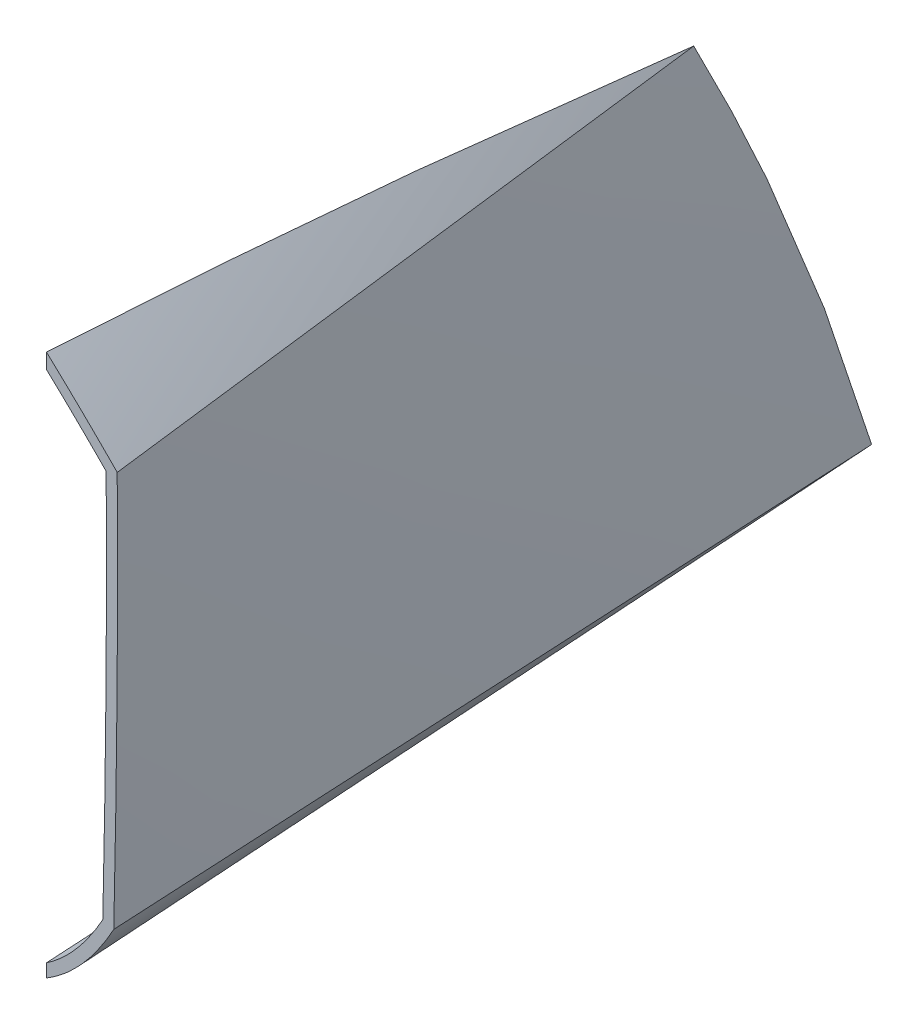
ISO-10303-21;
HEADER;
FILE_DESCRIPTION(('STEP AP214'),'2;1');
FILE_NAME('part.step','',(''),(''),'','','');
FILE_SCHEMA(('AUTOMOTIVE_DESIGN { 1 0 10303 214 1 1 1 1 }'));
ENDSEC;
DATA;
#1=APPLICATION_CONTEXT('core data for automotive mechanical design processes');
#2=APPLICATION_PROTOCOL_DEFINITION('international standard','automotive_design',2000,#1);
#3=PRODUCT_CONTEXT('',#1,'mechanical');
#4=PRODUCT('Part','Part','',(#3));
#5=PRODUCT_RELATED_PRODUCT_CATEGORY('part','',(#4));
#6=PRODUCT_DEFINITION_FORMATION('','',#4);
#7=PRODUCT_DEFINITION_CONTEXT('part definition',#1,'design');
#8=PRODUCT_DEFINITION('design','',#6,#7);
#9=PRODUCT_DEFINITION_SHAPE('','',#8);
#10=(LENGTH_UNIT() NAMED_UNIT(*) SI_UNIT(.MILLI.,.METRE.));
#11=(NAMED_UNIT(*) PLANE_ANGLE_UNIT() SI_UNIT($,.RADIAN.));
#12=(NAMED_UNIT(*) SI_UNIT($,.STERADIAN.) SOLID_ANGLE_UNIT());
#13=UNCERTAINTY_MEASURE_WITH_UNIT(LENGTH_MEASURE(1.E-05),#10,'distance_accuracy_value','');
#14=(GEOMETRIC_REPRESENTATION_CONTEXT(3) GLOBAL_UNCERTAINTY_ASSIGNED_CONTEXT((#13)) GLOBAL_UNIT_ASSIGNED_CONTEXT((#10,
#11,#12)) REPRESENTATION_CONTEXT('',''));
#15=CARTESIAN_POINT('',(0.,0.,0.));
#16=DIRECTION('',(0.,0.,1.));
#17=DIRECTION('',(1.,0.,0.));
#18=AXIS2_PLACEMENT_3D('',#15,#16,#17);
#19=CARTESIAN_POINT('',(-1.85359071851745,82.3592452516909,-1001.69455516353));
#20=DIRECTION('',(0.,0.,1.));
#21=DIRECTION('',(1.,0.,0.));
#22=AXIS2_PLACEMENT_3D('',#19,#20,#21);
#23=PLANE('',#22);
#24=CARTESIAN_POINT('',(12.2506221284304,-33.3759247497954,-1001.69455516353));
#25=CARTESIAN_POINT('',(11.9665362022267,-33.8949541881302,-1001.69455516353));
#26=CARTESIAN_POINT('',(11.6743257973484,-34.4096057442278,-1001.69455516353));
#27=CARTESIAN_POINT('',(11.0723934489428,-35.4288402213775,-1001.69455516353));
#28=CARTESIAN_POINT('',(10.762664299058,-35.9334188817556,-1001.69455516353));
#29=CARTESIAN_POINT('',(10.1236969935747,-36.9322759097013,-1001.69455516353));
#30=CARTESIAN_POINT('',(9.79440246591979,-37.4265183565635,-1001.69455516353));
#31=CARTESIAN_POINT('',(9.11606821113712,-38.4011372629972,-1001.69455516353));
#32=CARTESIAN_POINT('',(8.76703173429068,-38.8815159855145,-1001.69455516353));
#33=CARTESIAN_POINT('',(7.8346468950949,-40.1067780129237,-1001.69455516353));
#34=CARTESIAN_POINT('',(7.23513855485781,-40.8395052010551,-1001.69455516353));
#35=CARTESIAN_POINT('',(5.979494781417,-42.2535459545636,-1001.69455516353));
#36=CARTESIAN_POINT('',(5.32343414048144,-42.9349252587705,-1001.69455516353));
#37=CARTESIAN_POINT('',(4.28492192137854,-43.9190621542523,-1001.69455516353));
#38=CARTESIAN_POINT('',(3.92429833393614,-44.2450130538733,-1001.69455516353));
#39=CARTESIAN_POINT('',(3.18718687117368,-44.8784817424216,-1001.69455516353));
#40=CARTESIAN_POINT('',(2.8106999818198,-45.1860006740981,-1001.69455516353));
#41=CARTESIAN_POINT('',(2.03780124533057,-45.7839573130188,-1001.69455516353));
#42=CARTESIAN_POINT('',(1.6412173648594,-46.0741731463194,-1001.69455516353));
#43=CARTESIAN_POINT('',(0.832282530133182,-46.6320591845571,-1001.69455516353));
#44=CARTESIAN_POINT('',(0.419925481484258,-46.8997205443728,-1001.69455516353));
#45=CARTESIAN_POINT('',(0.,-47.1550952644895,-1001.69455516353));
#46=B_SPLINE_CURVE_WITH_KNOTS('',3,(#24,#25,#26,#27,#28,#29,#30,#31,#32,#33,#34,#35,#36,#37,#38,
#39,#40,#41,#42,#43,#44,#45),.UNSPECIFIED.,.F.,.F.,(4,2,2,2,2,2,2,2,2,2,4),(0.,1.77508414579676,
3.55090386143224,5.33211472196976,7.11303317575827,9.95051823445551,12.7843065711353,
14.2420959691526,15.6997948931357,17.1733307575318,18.6474418305088),.UNSPECIFIED.);
#47=CARTESIAN_POINT('',(12.2506221284304,-33.3759247497954,-1001.69455516353));
#48=VERTEX_POINT('',#47);
#49=CARTESIAN_POINT('',(0.,-47.1550952644895,-1001.69455516353));
#50=VERTEX_POINT('',#49);
#51=EDGE_CURVE('E244',#48,#50,#46,.T.);
#52=ORIENTED_EDGE('',*,*,#51,.F.);
#53=CARTESIAN_POINT('',(12.87399221668,38.8691970642356,-1001.69455516353));
#54=CARTESIAN_POINT('',(12.9048302297181,35.1504771052954,-1001.69455516353));
#55=CARTESIAN_POINT('',(12.9239638330814,31.4316727044196,-1001.69455516353));
#56=CARTESIAN_POINT('',(12.9407553095581,23.9940510049274,-1001.69455516353));
#57=CARTESIAN_POINT('',(12.9384133989228,20.275233706818,-1001.69455516353));
#58=CARTESIAN_POINT('',(12.9141875333494,12.8376837752516,-1001.69455516353));
#59=CARTESIAN_POINT('',(12.892303664979,9.11895114149253,-1001.69455516353));
#60=CARTESIAN_POINT('',(12.830733533716,1.68161652383183,-1001.69455516353));
#61=CARTESIAN_POINT('',(12.7910471759719,-2.03698545926815,-1001.69455516353));
#62=CARTESIAN_POINT('',(12.6841179998572,-10.3592843173215,-1001.69455516353));
#63=CARTESIAN_POINT('',(12.6125640403761,-14.9629260026864,-1001.69455516353));
#64=CARTESIAN_POINT('',(12.4887315274928,-21.8680628172549,-1001.69455516353));
#65=CARTESIAN_POINT('',(12.4447039948589,-24.1697105043796,-1001.69455516353));
#66=CARTESIAN_POINT('',(12.3514684362362,-28.7728983635731,-1001.69455516353));
#67=CARTESIAN_POINT('',(12.3022604163367,-31.0744385357652,-1001.69455516353));
#68=CARTESIAN_POINT('',(12.2506221284304,-33.3759247497954,-1001.69455516353));
#69=B_SPLINE_CURVE_WITH_KNOTS('',3,(#53,#54,#55,#56,#57,#58,#59,#60,#61,#62,#63,#64,#65,#66,#67,
#68),.UNSPECIFIED.,.F.,.F.,(4,2,2,2,2,2,2,4),(0.,11.156506614381,22.312900886518,
33.4692457378398,44.6256500307126,58.4381768848931,65.3443785037134,72.250572004854),.UNSPECIFIED.);
#70=CARTESIAN_POINT('',(12.87399221668,38.8691970642356,-1001.69455516353));
#71=VERTEX_POINT('',#70);
#72=EDGE_CURVE('E111',#71,#48,#69,.T.);
#73=ORIENTED_EDGE('',*,*,#72,.F.);
#74=CARTESIAN_POINT('',(0.,51.3948653500808,-1001.69455515866));
#75=CARTESIAN_POINT('',(1.09627781872572,50.3762662711366,-1001.69455516134));
#76=CARTESIAN_POINT('',(2.18691561433646,49.3515699825402,-1001.6945551628));
#77=CARTESIAN_POINT('',(4.89929351519833,46.7739307055295,-1001.69455516463));
#78=CARTESIAN_POINT('',(6.51368792573782,45.2132490840453,-1001.69455516408));
#79=CARTESIAN_POINT('',(9.71498589622055,42.0629575351107,-1001.69455516298));
#80=CARTESIAN_POINT('',(11.3018807223924,40.4733387344674,-1001.69455516243));
#81=CARTESIAN_POINT('',(12.87399221668,38.8691970642356,-1001.69455516353));
#82=B_SPLINE_CURVE_WITH_KNOTS('',3,(#74,#75,#76,#77,#78,#79,#80,#81),.UNSPECIFIED.,.F.,.F.,(4,2,
2,4),(0.,4.48937281379529,11.2253352202712,17.9633991227946),.UNSPECIFIED.);
#83=CARTESIAN_POINT('',(0.,51.3947834505475,-1001.69455036764));
#84=VERTEX_POINT('',#83);
#85=EDGE_CURVE('E110',#84,#71,#82,.T.);
#86=ORIENTED_EDGE('',*,*,#85,.F.);
#87=DIRECTION('',(0.,1.,0.));
#88=VECTOR('',#87,1.);
#89=CARTESIAN_POINT('',(0.,-48.8593102653782,-1001.69455516353));
#90=LINE('',#89,#88);
#91=CARTESIAN_POINT('',(0.,48.6560876059991,-1001.69455516353));
#92=VERTEX_POINT('',#91);
#93=EDGE_CURVE('E98',#92,#84,#90,.T.);
#94=ORIENTED_EDGE('',*,*,#93,.F.);
#95=CARTESIAN_POINT('',(-0.470868415865318,49.0970837952991,-1001.69455516353));
#96=CARTESIAN_POINT('',(0.523084267422174,48.1676972357709,-1001.69455516353));
#97=CARTESIAN_POINT('',(1.51228342820327,47.2332215512614,-1001.69455516353));
#98=CARTESIAN_POINT('',(3.48071667885832,45.354059698855,-1001.69455516353));
#99=CARTESIAN_POINT('',(4.45995190410198,44.4093747201652,-1001.69455516353));
#100=CARTESIAN_POINT('',(6.40867222971882,42.5091152142906,-1001.69455516353));
#101=CARTESIAN_POINT('',(7.37815268595554,41.5535359231248,-1001.69455516353));
#102=CARTESIAN_POINT('',(9.30666198240205,39.6316681242882,-1001.69455516353));
#103=CARTESIAN_POINT('',(10.2656896044509,38.6653783943507,-1001.69455516353));
#104=CARTESIAN_POINT('',(11.2192546963813,37.6937222153595,-1001.69455516353));
#105=B_SPLINE_CURVE_WITH_KNOTS('',3,(#95,#96,#97,#98,#99,#100,#101,#102,#103,#104),
.UNSPECIFIED.,.F.,.F.,(4,2,2,2,4),(0.,4.0823044315295,8.16413836305461,12.2478314865543,
16.331995536854),.UNSPECIFIED.);
#106=CARTESIAN_POINT('',(10.8687051671316,38.0504311350924,-1001.69455516353));
#107=VERTEX_POINT('',#106);
#108=EDGE_CURVE('E108',#92,#107,#105,.T.);
#109=ORIENTED_EDGE('',*,*,#108,.T.);
#110=CARTESIAN_POINT('',(10.8634474761459,38.6976045800277,-1001.69455516353));
#111=CARTESIAN_POINT('',(10.8943604346607,34.9729664361827,-1001.69455516353));
#112=CARTESIAN_POINT('',(10.9135198264841,31.2482433955654,-1001.69455516353));
#113=CARTESIAN_POINT('',(10.930279197301,23.7987844915915,-1001.69455516353));
#114=CARTESIAN_POINT('',(10.9278793936923,20.074048628743,-1001.69455516353));
#115=CARTESIAN_POINT('',(10.9034686935525,12.624662556447,-1001.69455516353));
#116=CARTESIAN_POINT('',(10.8814578845638,8.9000123466913,-1001.69455516353));
#117=CARTESIAN_POINT('',(10.8195741517478,1.4508429209225,-1001.69455516353));
#118=CARTESIAN_POINT('',(10.7797011331417,-2.27367629429067,-1001.69455516353));
#119=CARTESIAN_POINT('',(10.6730096058491,-10.5548723520559,-1001.69455516353));
#120=CARTESIAN_POINT('',(10.6021606196896,-15.1114967582731,-1001.69455516353));
#121=CARTESIAN_POINT('',(10.4388519095471,-24.2243142427248,-1001.69455516353));
#122=CARTESIAN_POINT('',(10.3463924044207,-28.7805073248601,-1001.69455516353));
#123=CARTESIAN_POINT('',(10.2444627874,-33.3364731838275,-1001.69455516353));
#124=B_SPLINE_CURVE_WITH_KNOTS('',3,(#110,#111,#112,#113,#114,#115,#116,#117,#118,#119,#120,
#121,#122,#123),.UNSPECIFIED.,.F.,.F.,(4,2,2,2,2,2,4),(0.,11.1742622973387,22.3484119162384,
33.5225116546183,44.6966706846869,58.3681408754672,72.0394726169845),.UNSPECIFIED.);
#125=CARTESIAN_POINT('',(10.255439277234,-32.8444063220594,-1001.69455516353));
#126=VERTEX_POINT('',#125);
#127=EDGE_CURVE('E119',#107,#126,#124,.T.);
#128=ORIENTED_EDGE('',*,*,#127,.T.);
#129=CARTESIAN_POINT('',(10.5640571013501,-32.2849484133639,-1001.69455516353));
#130=CARTESIAN_POINT('',(10.53627801153,-32.3358841591618,-1001.69455516353));
#131=CARTESIAN_POINT('',(10.5084544423362,-32.3867957749957,-1001.69455516353));
#132=CARTESIAN_POINT('',(10.4526780716934,-32.4885482051723,-1001.69455516353));
#133=CARTESIAN_POINT('',(10.4247252701264,-32.5393890194503,-1001.69455516353));
#134=CARTESIAN_POINT('',(10.3406129572114,-32.6917708106522,-1001.69455516353));
#135=CARTESIAN_POINT('',(10.2841992664371,-32.7931716351265,-1001.69455516353));
#136=CARTESIAN_POINT('',(10.1139677454087,-33.0968225482233,-1001.69455516353));
#137=CARTESIAN_POINT('',(9.99916092990484,-33.2985183844586,-1001.69455516353));
#138=CARTESIAN_POINT('',(9.65060137721084,-33.901310200971,-1001.69455516353));
#139=CARTESIAN_POINT('',(9.41274496609063,-34.3000451785245,-1001.69455516353));
#140=CARTESIAN_POINT('',(8.92482445796422,-35.0915018338494,-1001.69455516353));
#141=CARTESIAN_POINT('',(8.67472857704021,-35.4842039509008,-1001.69455516353));
#142=CARTESIAN_POINT('',(8.16230973303025,-36.2615028157454,-1001.69455516353));
#143=CARTESIAN_POINT('',(7.89998747200091,-36.6461000270972,-1001.69455516353));
#144=CARTESIAN_POINT('',(7.0914217108962,-37.7894321495063,-1001.69455516353));
#145=CARTESIAN_POINT('',(6.52555115913199,-38.5344744002358,-1001.69455516353));
#146=CARTESIAN_POINT('',(5.33718986852027,-39.9768884704693,-1001.69455516353));
#147=CARTESIAN_POINT('',(4.71477460474561,-40.674321720504,-1001.69455516353));
#148=CARTESIAN_POINT('',(3.84531882898528,-41.5632037252433,-1001.69455516353));
#149=CARTESIAN_POINT('',(3.62533146375063,-41.7813762665252,-1001.69455516353));
#150=CARTESIAN_POINT('',(3.17853230007473,-42.2106142404137,-1001.69455516353));
#151=CARTESIAN_POINT('',(2.95172049888938,-42.4216796701624,-1001.69455516353));
#152=CARTESIAN_POINT('',(2.26176835556505,-43.0426235669867,-1001.69455516353));
#153=CARTESIAN_POINT('',(1.78823803200105,-43.4411474457556,-1001.69455516353));
#154=CARTESIAN_POINT('',(1.05251107449432,-44.0163360695484,-1001.69455516353));
#155=CARTESIAN_POINT('',(0.800411729980777,-44.2060554630288,-1001.69455516353));
#156=CARTESIAN_POINT('',(0.289144668280426,-44.5757397595456,-1001.69455516353));
#157=CARTESIAN_POINT('',(0.0299771805829676,-44.7557049787164,-1001.69455516353));
#158=CARTESIAN_POINT('',(-0.49599667454968,-45.1057428927189,-1001.69455516353));
#159=CARTESIAN_POINT('',(-0.762822250010449,-45.2757867396114,-1001.69455516353));
#160=CARTESIAN_POINT('',(-1.30321732101772,-45.6048815788426,-1001.69455516353));
#161=CARTESIAN_POINT('',(-1.57678776399788,-45.7639310147522,-1001.69455516353));
#162=CARTESIAN_POINT('',(-1.85359071851749,-45.917180366797,-1001.69455516353));
#163=B_SPLINE_CURVE_WITH_KNOTS('',3,(#129,#130,#131,#132,#133,#134,#135,#136,#137,#138,#139,
#140,#141,#142,#143,#144,#145,#146,#147,#148,#149,#150,#151,#152,#153,#154,#155,#156,#157,#158,
#159,#160,#161,#162),.UNSPECIFIED.,.F.,.F.,(4,2,2,2,2,2,2,2,2,2,2,2,2,2,2,2,4),(0.,
0.174055171569712,0.348110502120936,0.696219458952698,1.39244656421967,2.78512361036199,
4.18163199686166,5.57806029236415,8.3822556372154,11.1827614861744,12.1121190942666,
13.0414770760587,14.8964424381214,15.8427966065658,16.7891200851607,17.7380705097596,
18.6871549990108),.UNSPECIFIED.);
#164=CARTESIAN_POINT('',(0.,-44.7736876415708,-1001.69455516353));
#165=VERTEX_POINT('',#164);
#166=EDGE_CURVE('E116',#126,#165,#163,.T.);
#167=ORIENTED_EDGE('',*,*,#166,.T.);
#168=EDGE_CURVE('E112',#50,#165,#90,.T.);
#169=ORIENTED_EDGE('',*,*,#168,.F.);
#170=EDGE_LOOP('',(#52,#73,#86,#94,#109,#128,#167,#169));
#171=FACE_BOUND('',#170,.T.);
#172=ADVANCED_FACE('F35',(#171),#23,.T.);
#173=CARTESIAN_POINT('',(0.,-48.8593102653782,-966.458177168164));
#174=DIRECTION('',(-1.,0.,0.));
#175=DIRECTION('',(0.,0.,1.));
#176=AXIS2_PLACEMENT_3D('',#173,#174,#175);
#177=PLANE('',#176);
#178=CARTESIAN_POINT('',(0.,-55.5034688895581,-776.7));
#179=CARTESIAN_POINT('',(0.,-50.8819255286531,-968.719076754564));
#180=CARTESIAN_POINT('',(0.,-38.1699211146485,-1151.69455516353));
#181=B_SPLINE_CURVE_WITH_KNOTS('',2,(#178,#179,#180),.UNSPECIFIED.,.F.,.F.,(3,3),(0.,1.),.UNSPECIFIED.);
#182=CARTESIAN_POINT('',(0.,-38.1699211146485,-1151.69455516353));
#183=VERTEX_POINT('',#182);
#184=EDGE_CURVE('E291',#50,#183,#181,.T.);
#185=ORIENTED_EDGE('',*,*,#184,.F.);
#186=ORIENTED_EDGE('',*,*,#168,.T.);
#187=CARTESIAN_POINT('',(0.,7.56244096415004,-1739.17775413218));
#188=CARTESIAN_POINT('',(0.,6.04028558589129,-1717.71886853241));
#189=CARTESIAN_POINT('',(0.,4.51654516736458,-1696.26009524189));
#190=CARTESIAN_POINT('',(0.,1.46507010409117,-1653.34066971762));
#191=CARTESIAN_POINT('',(0.,-0.0626649259069232,-1631.88001751127));
#192=CARTESIAN_POINT('',(0.,-3.1227708473084,-1588.9573161061));
#193=CARTESIAN_POINT('',(0.,-4.65514210018143,-1567.49526693304));
#194=CARTESIAN_POINT('',(0.,-7.72537707257804,-1524.57026902678));
#195=CARTESIAN_POINT('',(0.,-9.26324111565525,-1503.10732031671));
#196=CARTESIAN_POINT('',(0.,-12.3455387340583,-1460.18103635261));
#197=CARTESIAN_POINT('',(0.,-13.8899725682438,-1438.71770111716));
#198=CARTESIAN_POINT('',(0.,-15.954523704723,-1410.10016185366));
#199=CARTESIAN_POINT('',(0.,-16.4711104612878,-1402.94570305835));
#200=CARTESIAN_POINT('',(0.,-17.5052321098698,-1388.63685405093));
#201=CARTESIAN_POINT('',(0.,-18.0227670018779,-1381.48246383882));
#202=CARTESIAN_POINT('',(0.,-19.0588521507139,-1367.17375718517));
#203=CARTESIAN_POINT('',(0.,-19.5774024075063,-1360.01944074362));
#204=CARTESIAN_POINT('',(0.,-20.6157516521666,-1345.70869423443));
#205=CARTESIAN_POINT('',(0.,-21.1355509740434,-1338.55226419102));
#206=CARTESIAN_POINT('',(0.,-22.1763204891353,-1324.23948898116));
#207=CARTESIAN_POINT('',(0.,-22.6972906823927,-1317.08314381471));
#208=CARTESIAN_POINT('',(0.,-23.7404895620395,-1302.77054422932));
#209=CARTESIAN_POINT('',(0.,-24.2627182485995,-1295.6142898104));
#210=CARTESIAN_POINT('',(0.,-25.3085224153689,-1281.30196877076));
#211=CARTESIAN_POINT('',(0.,-25.8320978787632,-1274.14590214882));
#212=CARTESIAN_POINT('',(0.,-26.8807043795939,-1259.83387653516));
#213=CARTESIAN_POINT('',(0.,-27.4057354168296,-1252.67791754342));
#214=CARTESIAN_POINT('',(0.,-28.4573626702093,-1238.36611825809));
#215=CARTESIAN_POINT('',(0.,-28.9839588855494,-1231.21027796444));
#216=CARTESIAN_POINT('',(0.,-30.0388185670483,-1216.8989218844));
#217=CARTESIAN_POINT('',(0.,-30.5670819860673,-1209.74340609454));
#218=CARTESIAN_POINT('',(0.,-31.360830067994,-1199.0102306093));
#219=CARTESIAN_POINT('',(0.,-31.6256383233587,-1195.43252088219));
#220=CARTESIAN_POINT('',(0.,-32.155721287916,-1188.27713590074));
#221=CARTESIAN_POINT('',(0.,-32.4209959971189,-1184.69946064638));
#222=CARTESIAN_POINT('',(0.,-32.9520278373399,-1177.54413872177));
#223=CARTESIAN_POINT('',(0.,-33.2177849693249,-1173.96649205159));
#224=CARTESIAN_POINT('',(0.,-33.7497963280938,-1166.81123595092));
#225=CARTESIAN_POINT('',(0.,-34.0160505548388,-1163.23362652043));
#226=CARTESIAN_POINT('',(0.,-34.4158092355598,-1157.86732951647));
#227=CARTESIAN_POINT('',(0.,-34.5491217151459,-1156.07862764016));
#228=CARTESIAN_POINT('',(0.,-34.8158762986024,-1152.50123356463));
#229=CARTESIAN_POINT('',(0.,-34.9493184024721,-1150.71254136542));
#230=CARTESIAN_POINT('',(0.,-35.2163343800091,-1147.13516633404));
#231=CARTESIAN_POINT('',(0.,-35.3499082537108,-1145.34648350187));
#232=CARTESIAN_POINT('',(0.,-35.6171878372995,-1141.76912763192));
#233=CARTESIAN_POINT('',(0.,-35.7508935471906,-1139.98045459414));
#234=CARTESIAN_POINT('',(0.,-35.9515562804691,-1137.2974542764));
#235=CARTESIAN_POINT('',(0.,-36.018461165727,-1136.40312309703));
#236=CARTESIAN_POINT('',(0.,-36.1522986261962,-1134.61446279585));
#237=CARTESIAN_POINT('',(0.,-36.2192312014081,-1133.72013367406));
#238=CARTESIAN_POINT('',(0.,-36.3196730888299,-1132.3786432356));
#239=CARTESIAN_POINT('',(0.,-36.353160887734,-1131.93148031022));
#240=CARTESIAN_POINT('',(0.,-36.4200315558484,-1131.03714661605));
#241=CARTESIAN_POINT('',(0.,-36.4534144250598,-1130.58997584726));
#242=CARTESIAN_POINT('',(0.,-36.5534220752815,-1129.24845306142));
#243=CARTESIAN_POINT('',(0.,-36.6199059012432,-1128.35409053334));
#244=CARTESIAN_POINT('',(0.,-36.7524897397278,-1126.56533752951));
#245=CARTESIAN_POINT('',(0.,-36.818589752464,-1125.67094705379));
#246=CARTESIAN_POINT('',(0.,-36.9504089028407,-1123.88213800877));
#247=CARTESIAN_POINT('',(0.,-37.0161280404694,-1122.98771943947));
#248=CARTESIAN_POINT('',(0.,-37.2127142449051,-1120.30442176191));
#249=CARTESIAN_POINT('',(0.,-37.3430100950045,-1118.51550079543));
#250=CARTESIAN_POINT('',(0.,-37.7316199617492,-1113.14858363819));
#251=CARTESIAN_POINT('',(0.,-37.9876570997937,-1109.57042232875));
#252=CARTESIAN_POINT('',(0.,-38.4936973021648,-1102.41367099863));
#253=CARTESIAN_POINT('',(0.,-38.7437003626934,-1098.8350809777));
#254=CARTESIAN_POINT('',(0.,-39.2376933160419,-1091.67770842808));
#255=CARTESIAN_POINT('',(0.,-39.4816835800647,-1088.09892592502));
#256=CARTESIAN_POINT('',(0.,-39.9637018139473,-1080.94096047507));
#257=CARTESIAN_POINT('',(0.,-40.2017297854637,-1077.36177752829));
#258=CARTESIAN_POINT('',(0.,-40.6718586077728,-1070.20300281356));
#259=CARTESIAN_POINT('',(0.,-40.9039594264142,-1066.6234110435));
#260=CARTESIAN_POINT('',(0.,-41.3622654639718,-1059.46385011863));
#261=CARTESIAN_POINT('',(0.,-41.5884706822824,-1055.88388096377));
#262=CARTESIAN_POINT('',(0.,-42.2582920939646,-1045.14341253867));
#263=CARTESIAN_POINT('',(0.,-42.6931133562944,-1037.98236278404));
#264=CARTESIAN_POINT('',(0.,-43.5395598328565,-1023.65880696175));
#265=CARTESIAN_POINT('',(0.,-43.9511847654557,-1016.49630087747));
#266=CARTESIAN_POINT('',(0.,-44.7514836745167,-1002.17002559005));
#267=CARTESIAN_POINT('',(0.,-45.1401577108385,-995.006256390247));
#268=CARTESIAN_POINT('',(0.,-45.8948140861598,-980.677537757586));
#269=CARTESIAN_POINT('',(0.,-46.2607964751617,-973.512588327363));
#270=CARTESIAN_POINT('',(0.,-46.7816329458948,-962.993052775731));
#271=CARTESIAN_POINT('',(0.,-46.9452398903268,-959.638897955517));
#272=CARTESIAN_POINT('',(0.,-47.2675727253941,-952.930338128103));
#273=CARTESIAN_POINT('',(0.,-47.4262985932076,-949.575933119808));
#274=CARTESIAN_POINT('',(0.,-47.8951966680823,-939.512422406372));
#275=CARTESIAN_POINT('',(0.,-48.1980915897261,-932.802975690292));
#276=CARTESIAN_POINT('',(0.,-48.6380718989713,-922.738189461819));
#277=CARTESIAN_POINT('',(0.,-48.7823381714243,-919.383161741085));
#278=CARTESIAN_POINT('',(0.,-49.0661178616027,-912.672903029252));
#279=CARTESIAN_POINT('',(0.,-49.2056312766032,-909.317672038036));
#280=CARTESIAN_POINT('',(0.,-49.479940089432,-902.607018058482));
#281=CARTESIAN_POINT('',(0.,-49.6147354883841,-899.251595070189));
#282=CARTESIAN_POINT('',(0.,-49.8796444799989,-892.540565070708));
#283=CARTESIAN_POINT('',(0.,-50.009758073465,-889.184958059551));
#284=CARTESIAN_POINT('',(0.,-50.393131619358,-879.117871783329));
#285=CARTESIAN_POINT('',(0.,-50.6394243889681,-872.406126010327));
#286=CARTESIAN_POINT('',(0.,-51.1137375642046,-858.981989418142));
#287=CARTESIAN_POINT('',(0.,-51.3417579704115,-852.269598598979));
#288=CARTESIAN_POINT('',(0.,-51.6703220804744,-842.200577857668));
#289=CARTESIAN_POINT('',(0.,-51.7775989990969,-838.844166355507));
#290=CARTESIAN_POINT('',(0.,-51.9877042501012,-832.131203773142));
#291=CARTESIAN_POINT('',(0.,-52.0905325825008,-828.774652692939));
#292=CARTESIAN_POINT('',(0.,-52.2414687234112,-823.739727738338));
#293=CARTESIAN_POINT('',(0.,-52.2912297068093,-822.061403169147));
#294=CARTESIAN_POINT('',(0.,-52.5372922022476,-813.669693944905));
#295=CARTESIAN_POINT('',(0.,-52.7253659689767,-806.956066073663));
#296=CARTESIAN_POINT('',(0.,-53.0842791241122,-793.528349737344));
#297=CARTESIAN_POINT('',(0.,-53.2551185130457,-786.814261272282));
#298=CARTESIAN_POINT('',(0.,-53.417499790396,-780.099971438697));
#299=B_SPLINE_CURVE_WITH_KNOTS('',3,(#187,#188,#189,#190,#191,#192,#193,#194,#195,#196,#197,
#198,#199,#200,#201,#202,#203,#204,#205,#206,#207,#208,#209,#210,#211,#212,#213,#214,#215,#216,
#217,#218,#219,#220,#221,#222,#223,#224,#225,#226,#227,#228,#229,#230,#231,#232,#233,#234,#235,
#236,#237,#238,#239,#240,#241,#242,#243,#244,#245,#246,#247,#248,#249,#250,#251,#252,#253,#254,
#255,#256,#257,#258,#259,#260,#261,#262,#263,#264,#265,#266,#267,#268,#269,#270,#271,#272,#273,
#274,#275,#276,#277,#278,#279,#280,#281,#282,#283,#284,#285,#286,#287,#288,#289,#290,#291,#292,
#293,#294,#295,#296,#297,#298),.UNSPECIFIED.,.F.,.F.,(4,2,2,2,2,2,2,2,2,2,2,2,2,2,2,2,2,2,2,2,2,
2,2,2,2,2,2,2,2,2,2,2,2,2,2,2,2,2,2,2,2,2,2,2,2,2,2,2,2,2,2,2,2,2,2,4),(0.,64.5384115819478,
129.083295657243,193.633348882783,258.187269301606,322.743757246628,344.263010968793,
365.782264487647,387.301517256694,408.827365366716,430.353214254052,451.879066057183,
473.404650392047,494.930231759302,516.45580207152,537.98076910999,548.74325823627,
559.505747602758,570.268258566887,581.030768688056,586.41175740151,591.792746079561,
597.173736158848,602.554726404189,605.245217194509,607.935708030984,609.280953368614,
610.626198692574,613.316689245627,616.007178303532,618.697667445442,624.078646064398,
634.840570630185,645.602501969502,656.363767242914,667.125029526381,677.886350170902,
688.647671920794,710.17034691652,731.693283168699,753.216163282796,774.738995968362,
784.813420771564,794.887892671265,815.036700337566,825.111081865305,835.185469168647,
845.259854072464,855.334237247381,875.482999798499,895.631761709604,905.706135679822,
915.780509609878,920.817695746218,940.966456217492,961.115216072719),.UNSPECIFIED.);
#300=CARTESIAN_POINT('',(0.,-36.7218456043901,-1126.97851868063));
#301=VERTEX_POINT('',#300);
#302=EDGE_CURVE('E56',#165,#301,#299,.F.);
#303=ORIENTED_EDGE('',*,*,#302,.T.);
#304=CARTESIAN_POINT('',(0.,-36.7218456043901,-1126.97851868063));
#305=CARTESIAN_POINT('',(0.,-33.0767370503731,-1126.19822720666));
#306=CARTESIAN_POINT('',(0.,-29.4452201570076,-1125.35525017366));
#307=CARTESIAN_POINT('',(0.,-22.2123990714061,-1123.54949909859));
#308=CARTESIAN_POINT('',(0.,-18.6110923056088,-1122.58673537393));
#309=CARTESIAN_POINT('',(0.,-11.4413079505911,-1120.54691012352));
#310=CARTESIAN_POINT('',(0.,-7.87282840084279,-1119.46985547232));
#311=CARTESIAN_POINT('',(0.,-0.770570212034574,-1117.20682261304));
#312=CARTESIAN_POINT('',(0.,2.76320820075895,-1116.02084369524));
#313=CARTESIAN_POINT('',(0.,9.11405689664501,-1113.78480780078));
#314=CARTESIAN_POINT('',(0.,11.9375214522094,-1112.75284380208));
#315=CARTESIAN_POINT('',(0.,17.5599359694268,-1110.62429764752));
#316=CARTESIAN_POINT('',(0.,20.3588863337993,-1109.52771655548));
#317=CARTESIAN_POINT('',(0.,25.9314124357298,-1107.27272106056));
#318=CARTESIAN_POINT('',(0.,28.7049906769021,-1106.11431283732));
#319=CARTESIAN_POINT('',(0.,34.2265680813191,-1103.73816713697));
#320=CARTESIAN_POINT('',(0.,36.9745676816007,-1102.52043067576));
#321=CARTESIAN_POINT('',(0.,39.7095817290885,-1101.27431229361));
#322=B_SPLINE_CURVE_WITH_KNOTS('',3,(#304,#305,#306,#307,#308,#309,#310,#311,#312,#313,#314,
#315,#316,#317,#318,#319,#320,#321),.UNSPECIFIED.,.F.,.F.,(4,2,2,2,2,2,2,2,4),(0.,
11.1822727564534,22.363583033286,33.54422113999,44.7249321009303,53.7425855170865,
62.7600905121274,71.7766958855942,80.7931469173806),.UNSPECIFIED.);
#323=CARTESIAN_POINT('',(0.,39.7095817290887,-1101.2743122936));
#324=VERTEX_POINT('',#323);
#325=EDGE_CURVE('E100',#301,#324,#322,.T.);
#326=ORIENTED_EDGE('',*,*,#325,.T.);
#327=CARTESIAN_POINT('',(0.,39.7095817290887,-1101.2743122936));
#328=CARTESIAN_POINT('',(0.,40.0626711296442,-1098.36544650563));
#329=CARTESIAN_POINT('',(0.,40.406721147287,-1095.45549344359));
#330=CARTESIAN_POINT('',(0.,41.0773398110638,-1089.63358293229));
#331=CARTESIAN_POINT('',(0.,41.4039085157963,-1086.72162548978));
#332=CARTESIAN_POINT('',(0.,42.3582770928109,-1077.9831109206));
#333=CARTESIAN_POINT('',(0.,42.9607561418756,-1072.15377337337));
#334=CARTESIAN_POINT('',(0.,44.1025673348571,-1060.48902631348));
#335=CARTESIAN_POINT('',(0.,44.6419003161067,-1054.65361688238));
#336=CARTESIAN_POINT('',(0.,45.661434952344,-1042.97760928621));
#337=CARTESIAN_POINT('',(0.,46.1416362608994,-1037.13701109096));
#338=CARTESIAN_POINT('',(0.,47.0465611680696,-1025.45164355099));
#339=CARTESIAN_POINT('',(0.,47.4712858299619,-1019.60687428839));
#340=CARTESIAN_POINT('',(0.,48.2686334257359,-1007.91377948941));
#341=CARTESIAN_POINT('',(0.,48.6412562452947,-1002.06545394526));
#342=CARTESIAN_POINT('',(0.,49.3374894975246,-990.365967856526));
#343=CARTESIAN_POINT('',(0.,49.6611005416564,-984.514807348218));
#344=CARTESIAN_POINT('',(0.,50.2621689084683,-972.81012160494));
#345=CARTESIAN_POINT('',(0.,50.5396262165941,-966.956596369226));
#346=CARTESIAN_POINT('',(0.,51.0510205248604,-955.247704472239));
#347=CARTESIAN_POINT('',(0.,51.2849579183686,-949.392337828089));
#348=CARTESIAN_POINT('',(0.,51.7117558794009,-937.680108097479));
#349=CARTESIAN_POINT('',(0.,51.9046164112366,-931.823245009725));
#350=CARTESIAN_POINT('',(0.,52.251522995976,-920.108409778775));
#351=CARTESIAN_POINT('',(0.,52.4055692836152,-914.250437642502));
#352=CARTESIAN_POINT('',(0.,52.6769526146972,-902.533656966721));
#353=CARTESIAN_POINT('',(0.,52.7942897194171,-896.674848428627));
#354=CARTESIAN_POINT('',(0.,52.9942120511806,-884.956761495714));
#355=CARTESIAN_POINT('',(0.,53.0767979815738,-879.097483112806));
#356=CARTESIAN_POINT('',(0.,53.2090492477566,-867.378558169365));
#357=CARTESIAN_POINT('',(0.,53.2587145978118,-861.518911608994));
#358=CARTESIAN_POINT('',(0.,53.3098020624678,-852.729323529539));
#359=CARTESIAN_POINT('',(0.,53.3229294551923,-849.799445435015));
#360=CARTESIAN_POINT('',(0.,53.3415806441757,-843.939667104792));
#361=CARTESIAN_POINT('',(0.,53.3471044407747,-841.009766869096));
#362=CARTESIAN_POINT('',(0.,53.3562261061399,-826.36009969998));
#363=CARTESIAN_POINT('',(0.,53.3043304645629,-814.640225154412));
#364=CARTESIAN_POINT('',(0.,53.1794282885751,-800.735226566139));
#365=CARTESIAN_POINT('',(0.,53.1579384972714,-798.549535306496));
#366=CARTESIAN_POINT('',(0.,53.122967717767,-795.271026247764));
#367=CARTESIAN_POINT('',(0.,53.110854777664,-794.178194681109));
#368=CARTESIAN_POINT('',(0.,53.0857258556194,-791.992542100112));
#369=CARTESIAN_POINT('',(0.,53.0727098736794,-790.899721085769));
#370=CARTESIAN_POINT('',(0.,53.0323197200771,-787.621246456875));
#371=CARTESIAN_POINT('',(0.,53.0036036392703,-785.435609212534));
#372=CARTESIAN_POINT('',(0.,52.942659744247,-781.064377987746));
#373=CARTESIAN_POINT('',(0.,52.9104319209079,-778.878784007427));
#374=CARTESIAN_POINT('',(0.,52.8764816313944,-776.693217142278));
#375=B_SPLINE_CURVE_WITH_KNOTS('',3,(#327,#328,#329,#330,#331,#332,#333,#334,#335,#336,#337,
#338,#339,#340,#341,#342,#343,#344,#345,#346,#347,#348,#349,#350,#351,#352,#353,#354,#355,#356,
#357,#358,#359,#360,#361,#362,#363,#364,#365,#366,#367,#368,#369,#370,#371,#372,#373,#374),
.UNSPECIFIED.,.F.,.F.,(4,2,2,2,2,2,2,2,2,2,2,2,2,2,2,2,2,2,2,2,2,2,2,4),(0.,8.79061958601418,
17.5812097034786,35.1619724064667,52.7425019577262,70.3231345024065,87.9034300434,
105.483764158879,123.063878927682,140.643999240213,158.223960641858,175.803937317277,
193.383807672328,210.96364868197,228.543133865774,246.122611431838,254.912324384542,
263.702036944177,298.861277544585,305.418670013494,308.697365361076,311.976060703336,
318.533535260763,325.0910268535),.UNSPECIFIED.);
#376=EDGE_CURVE('E94',#324,#92,#375,.T.);
#377=ORIENTED_EDGE('',*,*,#376,.T.);
#378=ORIENTED_EDGE('',*,*,#93,.T.);
#379=CARTESIAN_POINT('',(0.,40.7270874531455,-1119.35040501048));
#380=CARTESIAN_POINT('',(0.,53.4963331626695,-1019.66315206373));
#381=CARTESIAN_POINT('',(0.,57.2550897612641,-903.793057059857));
#382=CARTESIAN_POINT('',(0.,55.1391260237737,-776.7));
#383=B_SPLINE_CURVE_WITH_KNOTS('',3,(#379,#380,#381,#382),.UNSPECIFIED.,.F.,.F.,(4,4),(0.,1.),.UNSPECIFIED.);
#384=CARTESIAN_POINT('',(0.,40.7270874531455,-1119.35040501048));
#385=VERTEX_POINT('',#384);
#386=EDGE_CURVE('E63',#385,#84,#383,.T.);
#387=ORIENTED_EDGE('',*,*,#386,.F.);
#388=CARTESIAN_POINT('',(0.,-38.1699211146485,-1151.69455516353));
#389=CARTESIAN_POINT('',(0.,1.16974114940501,-1140.00449157822));
#390=CARTESIAN_POINT('',(0.,40.7270874531455,-1119.35040501048));
#391=B_SPLINE_CURVE_WITH_KNOTS('',2,(#388,#389,#390),.UNSPECIFIED.,.F.,.F.,(3,3),(0.,1.),.UNSPECIFIED.);
#392=EDGE_CURVE('E279',#183,#385,#391,.T.);
#393=ORIENTED_EDGE('',*,*,#392,.F.);
#394=EDGE_LOOP('',(#185,#186,#303,#326,#377,#378,#387,#393));
#395=FACE_BOUND('',#394,.T.);
#396=ADVANCED_FACE('F97',(#395),#177,.T.);
#397=CARTESIAN_POINT('',(37.4930668801049,35.3163331638077,-776.7));
#398=CARTESIAN_POINT('',(0.,40.7270874531455,-1119.35040501048));
#399=CARTESIAN_POINT('',(36.3485741728955,25.0660935999469,-776.7));
#400=CARTESIAN_POINT('',(0.,27.5413053518987,-1126.23510053306));
#401=CARTESIAN_POINT('',(35.2040814656861,14.8158540360861,-776.7));
#402=CARTESIAN_POINT('',(0.,14.3736635872924,-1132.37279414044));
#403=CARTESIAN_POINT('',(32.9150960512672,-5.68462509163561,-776.7));
#404=CARTESIAN_POINT('',(0.,-11.9253392686389,-1143.15417752479));
#405=CARTESIAN_POINT('',(31.7706033440578,-15.9348646554965,-776.7));
#406=CARTESIAN_POINT('',(0.,-25.056700359964,-1147.79786730176));
#407=CARTESIAN_POINT('',(30.6261106368484,-26.1851042193574,-776.7));
#408=CARTESIAN_POINT('',(0.,-38.1699211146485,-1151.69455516353));
#409=B_SPLINE_SURFACE_WITH_KNOTS('',3,1,((#397,#398),(#399,#400),(#401,#402),(#403,#404),(#405,
#406),(#407,#408)),.UNSPECIFIED.,.F.,.F.,.F.,(4,2,4),(2,2),(0.,0.5,1.),(0.,1.),.UNSPECIFIED.);
#410=DIRECTION('',(0.108758141204159,-0.015695263897792,0.99394432711948));
#411=VECTOR('',#410,1.);
#412=CARTESIAN_POINT('',(18.7465334400525,38.0217103084766,-948.025202505238));
#413=LINE('',#412,#411);
#414=EDGE_CURVE('E103',#385,#71,#413,.T.);
#415=DIRECTION('',(-0.0813585264615033,-0.0318377692183559,-0.996176262828628));
#416=VECTOR('',#415,1.);
#417=CARTESIAN_POINT('',(15.3130553184242,-32.1775126670029,-964.197277581765));
#418=LINE('',#417,#416);
#419=EDGE_CURVE('E241',#48,#183,#418,.T.);
#420=ORIENTED_EDGE('',*,*,#414,.T.);
#421=ORIENTED_EDGE('',*,*,#72,.T.);
#422=ORIENTED_EDGE('',*,*,#419,.T.);
#423=ORIENTED_EDGE('',*,*,#392,.T.);
#424=EDGE_LOOP('',(#420,#421,#422,#423));
#425=FACE_BOUND('',#424,.T.);
#426=ADVANCED_FACE('F177',(#425),#409,.T.);
#427=CARTESIAN_POINT('',(49.748588655198,34.991123026963,-776.7));
#428=CARTESIAN_POINT('',(0.,-12.7459122866393,-1517.64551198146));
#429=CARTESIAN_POINT('',(-49.748588655198,-60.4829476002416,-2258.59102396293));
#430=CARTESIAN_POINT('',(40.1873496460232,4.40300940380282,-776.7));
#431=CARTESIAN_POINT('',(0.,-25.4579167006439,-1334.6700335725));
#432=CARTESIAN_POINT('',(-40.1873496460232,-55.3188428050906,-1892.64006714499));
#433=CARTESIAN_POINT('',(30.6261106368484,-26.1851042193574,-776.7));
#434=CARTESIAN_POINT('',(0.,-38.1699211146485,-1151.69455516353));
#435=CARTESIAN_POINT('',(-30.6261106368484,-50.1547380099396,-1526.68911032706));
#436=CARTESIAN_POINT('',(21.0648716276736,-56.7732178425175,-776.7));
#437=CARTESIAN_POINT('',(0.,-50.8819255286531,-968.719076754564));
#438=CARTESIAN_POINT('',(-21.0648716276736,-44.9906332147886,-1160.73815350913));
#439=CARTESIAN_POINT('',(0.,-55.5034688895581,-776.7));
#440=CARTESIAN_POINT('',(0.,-55.5034688895581,-776.7));
#441=CARTESIAN_POINT('',(0.,-55.5034688895581,-776.7));
#442=B_SPLINE_SURFACE_WITH_KNOTS('',2,1,((#427,#428,#429),(#430,#431,#432),(#433,#434,#435),
(#436,#437,#438),(#439,#440,#441)),.UNSPECIFIED.,.F.,.F.,.F.,(3,2,3),(2,1,2),(-1.,0.,1.),(0.,1.,
2.),.UNSPECIFIED.);
#443=ORIENTED_EDGE('',*,*,#419,.F.);
#444=ORIENTED_EDGE('',*,*,#51,.T.);
#445=ORIENTED_EDGE('',*,*,#184,.T.);
#446=EDGE_LOOP('',(#443,#444,#445));
#447=FACE_BOUND('',#446,.T.);
#448=ADVANCED_FACE('F139',(#447),#442,.T.);
#449=CARTESIAN_POINT('',(0.,55.1391260237737,-776.7));
#450=CARTESIAN_POINT('',(0.,55.1391260237737,-776.7));
#451=CARTESIAN_POINT('',(0.,55.1391260237737,-776.7));
#452=CARTESIAN_POINT('',(6.31133292481769,51.791709406992,-776.064534714701));
#453=CARTESIAN_POINT('',(6.24884448001751,51.8353272137794,-776.7));
#454=CARTESIAN_POINT('',(0.,56.1971078925189,-840.246528529929));
#455=CARTESIAN_POINT('',(12.6226658496354,48.4589795910504,-775.457126834541));
#456=CARTESIAN_POINT('',(12.497688960035,48.531528403785,-776.7));
#457=CARTESIAN_POINT('',(0.,55.7864096772429,-900.98731654586));
#458=CARTESIAN_POINT('',(25.2453316992707,41.8307329827849,-774.310825584506));
#459=CARTESIAN_POINT('',(24.99537792007,41.9239307837963,-776.7));
#460=CARTESIAN_POINT('',(0.,51.2437108849372,-1015.61744154945));
#461=CARTESIAN_POINT('',(31.5566646240883,38.5352161904609,-773.771932214629));
#462=CARTESIAN_POINT('',(31.2442224000875,38.620131973802,-776.7));
#463=CARTESIAN_POINT('',(0.,47.1117103079075,-1069.5067785371));
#464=CARTESIAN_POINT('',(37.867997548906,35.2622256209143,-773.273495949895));
#465=CARTESIAN_POINT('',(37.4930668801049,35.3163331638077,-776.7));
#466=CARTESIAN_POINT('',(0.,40.7270874531455,-1119.35040501048));
#467=B_SPLINE_SURFACE_WITH_KNOTS('',3,1,((#449,#450,#451),(#452,#453,#454),(#455,#456,#457),
(#458,#459,#460),(#461,#462,#463),(#464,#465,#466)),.UNSPECIFIED.,.F.,.F.,.F.,(4,2,4),(2,1,2),
(0.,0.5,1.),(-0.01,0.,1.),.UNSPECIFIED.);
#468=ORIENTED_EDGE('',*,*,#386,.T.);
#469=ORIENTED_EDGE('',*,*,#85,.T.);
#470=ORIENTED_EDGE('',*,*,#414,.F.);
#471=EDGE_LOOP('',(#468,#469,#470));
#472=FACE_BOUND('',#471,.T.);
#473=ADVANCED_FACE('F170',(#472),#467,.T.);
#474=CARTESIAN_POINT('',(37.4930668801049,35.3163331638077,-776.7));
#475=CARTESIAN_POINT('',(0.,40.7270874531455,-1119.35040501048));
#476=CARTESIAN_POINT('',(36.3485741728955,25.0660935999469,-776.7));
#477=CARTESIAN_POINT('',(0.,27.5413053518987,-1126.23510053306));
#478=CARTESIAN_POINT('',(35.2040814656861,14.8158540360861,-776.7));
#479=CARTESIAN_POINT('',(0.,14.3736635872924,-1132.37279414044));
#480=CARTESIAN_POINT('',(32.9150960512672,-5.68462509163561,-776.7));
#481=CARTESIAN_POINT('',(0.,-11.9253392686389,-1143.15417752479));
#482=CARTESIAN_POINT('',(31.7706033440578,-15.9348646554965,-776.7));
#483=CARTESIAN_POINT('',(0.,-25.056700359964,-1147.79786730176));
#484=CARTESIAN_POINT('',(30.6261106368484,-26.1851042193574,-776.7));
#485=CARTESIAN_POINT('',(0.,-38.1699211146485,-1151.69455516353));
#486=B_SPLINE_SURFACE_WITH_KNOTS('',3,1,((#474,#475),(#476,#477),(#478,#479),(#480,#481),(#482,
#483),(#484,#485)),.UNSPECIFIED.,.F.,.F.,.F.,(4,2,4),(2,2),(0.,0.5,1.),(0.,1.),.UNSPECIFIED.);
#487=OFFSET_SURFACE('',#486,-2.,.F.);
#488=ORIENTED_EDGE('',*,*,#127,.F.);
#489=CARTESIAN_POINT('',(-11.8310287995525,41.4913334050886,-1209.55431126844));
#490=CARTESIAN_POINT('',(-9.44696365588017,41.1343210940171,-1187.74349607784));
#491=CARTESIAN_POINT('',(-7.06334688771118,40.7763103711323,-1165.93264812879));
#492=CARTESIAN_POINT('',(-2.29743375010529,40.0577793477639,-1122.31084891964));
#493=CARTESIAN_POINT('',(0.0848626193075824,39.6972590472345,-1100.49989765955));
#494=CARTESIAN_POINT('',(4.84771143581885,38.9731960954928,-1056.87785289601));
#495=CARTESIAN_POINT('',(7.22826388276272,38.6096534440126,-1035.06675939255));
#496=CARTESIAN_POINT('',(11.9870070679529,37.8788958000759,-991.444376290141));
#497=CARTESIAN_POINT('',(14.365197806211,37.5116808076378,-969.633086691181));
#498=CARTESIAN_POINT('',(18.3553674684074,36.8914093542996,-933.012807037519));
#499=CARTESIAN_POINT('',(19.9682106716426,36.6395523694879,-918.203890843642));
#500=CARTESIAN_POINT('',(23.1920685838236,36.1335007219668,-888.585899440957));
#501=CARTESIAN_POINT('',(24.8030832927814,35.879306059273,-873.77682423215));
#502=CARTESIAN_POINT('',(28.0228660022181,35.3682628270234,-844.158475108503));
#503=CARTESIAN_POINT('',(29.6316340026685,35.111414257434,-829.34920119366));
#504=CARTESIAN_POINT('',(32.8463640120542,34.5946871806962,-799.730401347027));
#505=CARTESIAN_POINT('',(34.4523260209233,34.3348086734761,-784.920875415232));
#506=CARTESIAN_POINT('',(36.0566053646467,34.0732271865677,-770.111197075898));
#507=B_SPLINE_CURVE_WITH_KNOTS('',3,(#489,#490,#491,#492,#493,#494,#495,#496,#497,#498,#499,
#500,#501,#502,#503,#504,#505,#506),.UNSPECIFIED.,.F.,.F.,(4,2,2,2,2,2,2,2,4),(0.,
65.8308891595445,131.661779517651,197.49267570814,263.323571570581,308.019412807287,
352.715253745893,397.411095249643,442.106937809786),.UNSPECIFIED.);
#508=EDGE_CURVE('E11',#324,#107,#507,.T.);
#509=ORIENTED_EDGE('',*,*,#508,.F.);
#510=ORIENTED_EDGE('',*,*,#325,.F.);
#511=CARTESIAN_POINT('',(39.0204863538809,-21.7440671398803,-649.813521217548));
#512=CARTESIAN_POINT('',(36.8343951191389,-22.5977346530315,-676.575808583713));
#513=CARTESIAN_POINT('',(34.6479881908091,-23.4495216852653,-703.338130208446));
#514=CARTESIAN_POINT('',(30.2744702356967,-25.1490003079089,-756.862846284112));
#515=CARTESIAN_POINT('',(28.0873592089053,-25.9966918982684,-783.625240735044));
#516=CARTESIAN_POINT('',(23.8065139828014,-27.6512544275661,-835.998206856767));
#517=CARTESIAN_POINT('',(21.7128124968451,-28.4583119351322,-861.608775306692));
#518=CARTESIAN_POINT('',(17.5245928874388,-30.0679109749565,-912.82998724993));
#519=CARTESIAN_POINT('',(15.4300747639937,-30.8704525072421,-938.440630743244));
#520=CARTESIAN_POINT('',(12.2404625782494,-32.0884264758102,-977.43260939351));
#521=CARTESIAN_POINT('',(11.1457179870881,-32.5057147611999,-990.813915192339));
#522=CARTESIAN_POINT('',(7.8610542930442,-33.7553435487709,-1030.95786786162));
#523=CARTESIAN_POINT('',(5.67070533223956,-34.5854479583411,-1057.72054923893));
#524=CARTESIAN_POINT('',(1.28860926399379,-36.2388151677766,-1111.24600932105));
#525=CARTESIAN_POINT('',(-0.903137843473239,-37.0620779675151,-1138.00878802586));
#526=CARTESIAN_POINT('',(-3.09570991313499,-37.8814805988411,-1164.77161755324));
#527=B_SPLINE_CURVE_WITH_KNOTS('',3,(#511,#512,#513,#514,#515,#516,#517,#518,#519,#520,#521,
#522,#523,#524,#525,#526),.UNSPECIFIED.,.F.,.F.,(4,2,2,2,2,2,2,4),(0.,80.5949745203423,
161.18995003157,238.315984826032,315.442019152913,355.739506137064,436.334482411963,
516.929460179895),.UNSPECIFIED.);
#528=EDGE_CURVE('E48',#126,#301,#527,.T.);
#529=ORIENTED_EDGE('',*,*,#528,.F.);
#530=EDGE_LOOP('',(#488,#509,#510,#529));
#531=FACE_BOUND('',#530,.T.);
#532=ADVANCED_FACE('F175',(#531),#487,.F.);
#533=CARTESIAN_POINT('',(49.748588655198,34.991123026963,-776.7));
#534=CARTESIAN_POINT('',(-49.748588655198,-60.4829476002416,-2258.59102396293));
#535=CARTESIAN_POINT('',(40.1873496460232,4.40300940380282,-776.7));
#536=CARTESIAN_POINT('',(-40.1873496460232,-55.3188428050906,-1892.64006714499));
#537=CARTESIAN_POINT('',(21.0648716276736,-56.7732178425175,-776.7));
#538=CARTESIAN_POINT('',(-21.0648716276736,-44.9906332147886,-1160.73815350913));
#539=CARTESIAN_POINT('',(0.,-55.5034688895581,-776.7));
#540=CARTESIAN_POINT('',(0.,-55.5034688895581,-776.7));
#541=B_SPLINE_SURFACE_WITH_KNOTS('',2,1,((#533,#534),(#535,#536),(#537,#538),(#539,#540)),
.UNSPECIFIED.,.F.,.F.,.F.,(3,1,3),(2,2),(-1.,0.,1.),(0.,2.),.UNSPECIFIED.);
#542=OFFSET_SURFACE('',#541,-2.,.F.);
#543=ORIENTED_EDGE('',*,*,#166,.F.);
#544=ORIENTED_EDGE('',*,*,#528,.T.);
#545=ORIENTED_EDGE('',*,*,#302,.F.);
#546=EDGE_LOOP('',(#543,#544,#545));
#547=FACE_BOUND('',#546,.T.);
#548=ADVANCED_FACE('F254',(#547),#542,.F.);
#549=CARTESIAN_POINT('',(0.,55.1391260237737,-776.7));
#550=CARTESIAN_POINT('',(0.,55.1391260237737,-776.7));
#551=CARTESIAN_POINT('',(6.31133292481769,51.791709406992,-776.064534714701));
#552=CARTESIAN_POINT('',(0.,56.1971078925189,-840.246528529929));
#553=CARTESIAN_POINT('',(12.6226658496354,48.4589795910504,-775.457126834541));
#554=CARTESIAN_POINT('',(0.,55.7864096772429,-900.98731654586));
#555=CARTESIAN_POINT('',(25.2453316992707,41.8307329827849,-774.310825584506));
#556=CARTESIAN_POINT('',(0.,51.2437108849372,-1015.61744154945));
#557=CARTESIAN_POINT('',(31.5566646240883,38.5352161904609,-773.771932214629));
#558=CARTESIAN_POINT('',(0.,47.1117103079075,-1069.5067785371));
#559=CARTESIAN_POINT('',(37.867997548906,35.2622256209143,-773.273495949895));
#560=CARTESIAN_POINT('',(0.,40.7270874531455,-1119.35040501048));
#561=B_SPLINE_SURFACE_WITH_KNOTS('',3,1,((#549,#550),(#551,#552),(#553,#554),(#555,#556),(#557,
#558),(#559,#560)),.UNSPECIFIED.,.F.,.F.,.F.,(4,2,4),(2,2),(0.,0.5,1.),(-0.01,1.),.UNSPECIFIED.);
#562=OFFSET_SURFACE('',#561,-2.,.F.);
#563=ORIENTED_EDGE('',*,*,#108,.F.);
#564=ORIENTED_EDGE('',*,*,#376,.F.);
#565=ORIENTED_EDGE('',*,*,#508,.T.);
#566=EDGE_LOOP('',(#563,#564,#565));
#567=FACE_BOUND('',#566,.T.);
#568=ADVANCED_FACE('F114',(#567),#562,.F.);
#569=CLOSED_SHELL('',(#172,#396,#426,#448,#473,#532,#548,#568));
#570=MANIFOLD_SOLID_BREP('B2',#569);
#571=ADVANCED_BREP_SHAPE_REPRESENTATION('',(#18,#570),#14);
#572=SHAPE_DEFINITION_REPRESENTATION(#9,#571);
ENDSEC;
END-ISO-10303-21;
